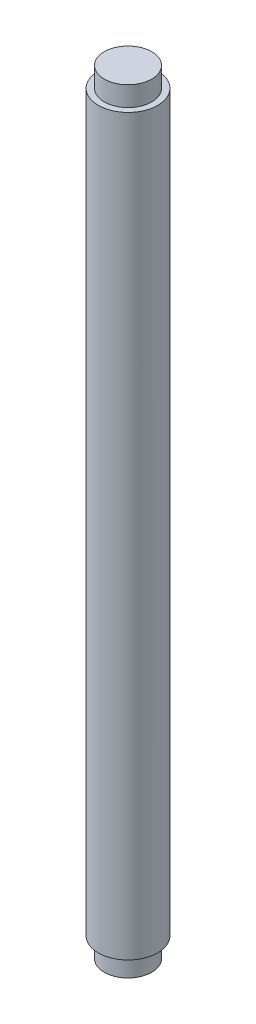
ISO-10303-21;
HEADER;
FILE_DESCRIPTION(('STEP AP214'),'2;1');
FILE_NAME('part.step','',(''),(''),'','','');
FILE_SCHEMA(('AUTOMOTIVE_DESIGN { 1 0 10303 214 1 1 1 1 }'));
ENDSEC;
DATA;
#1=APPLICATION_CONTEXT('core data for automotive mechanical design processes');
#2=APPLICATION_PROTOCOL_DEFINITION('international standard','automotive_design',2000,#1);
#3=PRODUCT_CONTEXT('',#1,'mechanical');
#4=PRODUCT('Part','Part','',(#3));
#5=PRODUCT_RELATED_PRODUCT_CATEGORY('part','',(#4));
#6=PRODUCT_DEFINITION_FORMATION('','',#4);
#7=PRODUCT_DEFINITION_CONTEXT('part definition',#1,'design');
#8=PRODUCT_DEFINITION('design','',#6,#7);
#9=PRODUCT_DEFINITION_SHAPE('','',#8);
#10=(LENGTH_UNIT() NAMED_UNIT(*) SI_UNIT(.MILLI.,.METRE.));
#11=(NAMED_UNIT(*) PLANE_ANGLE_UNIT() SI_UNIT($,.RADIAN.));
#12=(NAMED_UNIT(*) SI_UNIT($,.STERADIAN.) SOLID_ANGLE_UNIT());
#13=UNCERTAINTY_MEASURE_WITH_UNIT(LENGTH_MEASURE(1.E-05),#10,'distance_accuracy_value','');
#14=(GEOMETRIC_REPRESENTATION_CONTEXT(3) GLOBAL_UNCERTAINTY_ASSIGNED_CONTEXT((#13)) GLOBAL_UNIT_ASSIGNED_CONTEXT((#10,
#11,#12)) REPRESENTATION_CONTEXT('',''));
#15=CARTESIAN_POINT('',(0.,0.,0.));
#16=DIRECTION('',(0.,0.,1.));
#17=DIRECTION('',(1.,0.,0.));
#18=AXIS2_PLACEMENT_3D('',#15,#16,#17);
#19=CARTESIAN_POINT('',(0.,195.5,0.));
#20=DIRECTION('',(0.,-1.,0.));
#21=DIRECTION('',(0.,0.,-1.));
#22=AXIS2_PLACEMENT_3D('',#19,#20,#21);
#23=CYLINDRICAL_SURFACE('',#22,15.);
#24=CARTESIAN_POINT('',(0.,185.5,0.));
#25=DIRECTION('',(0.,1.,0.));
#26=DIRECTION('',(0.,0.,1.));
#27=AXIS2_PLACEMENT_3D('',#24,#25,#26);
#28=CIRCLE('',#27,15.);
#29=CARTESIAN_POINT('',(0.,185.5,15.));
#30=VERTEX_POINT('',#29);
#31=EDGE_CURVE('E14',#30,#30,#28,.T.);
#32=ORIENTED_EDGE('',*,*,#31,.F.);
#33=EDGE_LOOP('',(#32));
#34=FACE_BOUND('',#33,.T.);
#35=CARTESIAN_POINT('',(0.,-185.5,0.));
#36=DIRECTION('',(0.,-1.,0.));
#37=DIRECTION('',(0.,0.,-1.));
#38=AXIS2_PLACEMENT_3D('',#35,#36,#37);
#39=CIRCLE('',#38,15.);
#40=CARTESIAN_POINT('',(0.,-185.5,-15.));
#41=VERTEX_POINT('',#40);
#42=EDGE_CURVE('E56',#41,#41,#39,.T.);
#43=ORIENTED_EDGE('',*,*,#42,.F.);
#44=EDGE_LOOP('',(#43));
#45=FACE_BOUND('',#44,.T.);
#46=ADVANCED_FACE('F53',(#34,#45),#23,.T.);
#47=CARTESIAN_POINT('',(0.,185.5,0.));
#48=DIRECTION('',(0.,1.,0.));
#49=DIRECTION('',(0.,0.,1.));
#50=AXIS2_PLACEMENT_3D('',#47,#48,#49);
#51=PLANE('',#50);
#52=CARTESIAN_POINT('',(0.,185.5,0.));
#53=DIRECTION('',(0.,1.,0.));
#54=DIRECTION('',(0.,0.,1.));
#55=AXIS2_PLACEMENT_3D('',#52,#53,#54);
#56=CIRCLE('',#55,12.);
#57=CARTESIAN_POINT('',(0.,185.5,12.));
#58=VERTEX_POINT('',#57);
#59=EDGE_CURVE('E60',#58,#58,#56,.T.);
#60=ORIENTED_EDGE('',*,*,#59,.F.);
#61=EDGE_LOOP('',(#60));
#62=FACE_BOUND('',#61,.T.);
#63=ORIENTED_EDGE('',*,*,#31,.T.);
#64=EDGE_LOOP('',(#63));
#65=FACE_BOUND('',#64,.T.);
#66=ADVANCED_FACE('F96',(#62,#65),#51,.T.);
#67=CARTESIAN_POINT('',(0.,185.5,0.));
#68=DIRECTION('',(0.,1.,0.));
#69=DIRECTION('',(0.,0.,1.));
#70=AXIS2_PLACEMENT_3D('',#67,#68,#69);
#71=CYLINDRICAL_SURFACE('',#70,12.);
#72=ORIENTED_EDGE('',*,*,#59,.T.);
#73=EDGE_LOOP('',(#72));
#74=FACE_BOUND('',#73,.T.);
#75=CARTESIAN_POINT('',(0.,195.5,0.));
#76=DIRECTION('',(0.,1.,0.));
#77=DIRECTION('',(0.,0.,1.));
#78=AXIS2_PLACEMENT_3D('',#75,#76,#77);
#79=CIRCLE('',#78,12.);
#80=CARTESIAN_POINT('',(0.,195.5,12.));
#81=VERTEX_POINT('',#80);
#82=EDGE_CURVE('E86',#81,#81,#79,.T.);
#83=ORIENTED_EDGE('',*,*,#82,.F.);
#84=EDGE_LOOP('',(#83));
#85=FACE_BOUND('',#84,.T.);
#86=ADVANCED_FACE('F101',(#74,#85),#71,.T.);
#87=CARTESIAN_POINT('',(0.,195.5,0.));
#88=DIRECTION('',(0.,1.,0.));
#89=DIRECTION('',(0.,0.,1.));
#90=AXIS2_PLACEMENT_3D('',#87,#88,#89);
#91=PLANE('',#90);
#92=ORIENTED_EDGE('',*,*,#82,.T.);
#93=EDGE_LOOP('',(#92));
#94=FACE_BOUND('',#93,.T.);
#95=ADVANCED_FACE('F109',(#94),#91,.T.);
#96=CARTESIAN_POINT('',(0.,-185.5,0.));
#97=DIRECTION('',(0.,-1.,0.));
#98=DIRECTION('',(0.,0.,-1.));
#99=AXIS2_PLACEMENT_3D('',#96,#97,#98);
#100=PLANE('',#99);
#101=CARTESIAN_POINT('',(0.,-185.5,0.));
#102=DIRECTION('',(0.,1.,0.));
#103=DIRECTION('',(0.,0.,1.));
#104=AXIS2_PLACEMENT_3D('',#101,#102,#103);
#105=CIRCLE('',#104,12.);
#106=CARTESIAN_POINT('',(0.,-185.5,12.));
#107=VERTEX_POINT('',#106);
#108=EDGE_CURVE('E77',#107,#107,#105,.T.);
#109=ORIENTED_EDGE('',*,*,#108,.T.);
#110=EDGE_LOOP('',(#109));
#111=FACE_BOUND('',#110,.T.);
#112=ORIENTED_EDGE('',*,*,#42,.T.);
#113=EDGE_LOOP('',(#112));
#114=FACE_BOUND('',#113,.T.);
#115=ADVANCED_FACE('F93',(#111,#114),#100,.T.);
#116=CARTESIAN_POINT('',(0.,-185.5,0.));
#117=DIRECTION('',(0.,-1.,0.));
#118=DIRECTION('',(0.,0.,-1.));
#119=AXIS2_PLACEMENT_3D('',#116,#117,#118);
#120=CYLINDRICAL_SURFACE('',#119,12.);
#121=ORIENTED_EDGE('',*,*,#108,.F.);
#122=EDGE_LOOP('',(#121));
#123=FACE_BOUND('',#122,.T.);
#124=CARTESIAN_POINT('',(0.,-195.5,0.));
#125=DIRECTION('',(0.,1.,0.));
#126=DIRECTION('',(0.,0.,1.));
#127=AXIS2_PLACEMENT_3D('',#124,#125,#126);
#128=CIRCLE('',#127,12.);
#129=CARTESIAN_POINT('',(0.,-195.5,12.));
#130=VERTEX_POINT('',#129);
#131=EDGE_CURVE('E73',#130,#130,#128,.T.);
#132=ORIENTED_EDGE('',*,*,#131,.T.);
#133=EDGE_LOOP('',(#132));
#134=FACE_BOUND('',#133,.T.);
#135=ADVANCED_FACE('F117',(#123,#134),#120,.T.);
#136=CARTESIAN_POINT('',(0.,-195.5,0.));
#137=DIRECTION('',(0.,1.,0.));
#138=DIRECTION('',(0.,0.,1.));
#139=AXIS2_PLACEMENT_3D('',#136,#137,#138);
#140=PLANE('',#139);
#141=CARTESIAN_POINT('',(0.,-195.5,0.));
#142=DIRECTION('',(0.,-1.,0.));
#143=DIRECTION('',(0.,0.,-1.));
#144=AXIS2_PLACEMENT_3D('',#141,#142,#143);
#145=CIRCLE('',#144,6.75);
#146=CARTESIAN_POINT('',(0.,-195.5,-6.75));
#147=VERTEX_POINT('',#146);
#148=EDGE_CURVE('E74',#147,#147,#145,.T.);
#149=ORIENTED_EDGE('',*,*,#148,.F.);
#150=EDGE_LOOP('',(#149));
#151=FACE_BOUND('',#150,.T.);
#152=ORIENTED_EDGE('',*,*,#131,.F.);
#153=EDGE_LOOP('',(#152));
#154=FACE_BOUND('',#153,.T.);
#155=ADVANCED_FACE('F67',(#151,#154),#140,.F.);
#156=CARTESIAN_POINT('',(0.,-193.5,0.));
#157=DIRECTION('',(0.,-1.,0.));
#158=DIRECTION('',(0.,0.,-1.));
#159=AXIS2_PLACEMENT_3D('',#156,#157,#158);
#160=CONICAL_SURFACE('',#159,6.75,1.02974425867665);
#161=CARTESIAN_POINT('',(0.,-189.444190821564,0.));
#162=VERTEX_POINT('',#161);
#163=VERTEX_LOOP('',#162);
#164=FACE_BOUND('',#163,.T.);
#165=CARTESIAN_POINT('',(0.,-193.5,0.));
#166=DIRECTION('',(0.,-1.,0.));
#167=DIRECTION('',(0.,0.,-1.));
#168=AXIS2_PLACEMENT_3D('',#165,#166,#167);
#169=CIRCLE('',#168,6.75);
#170=CARTESIAN_POINT('',(0.,-193.5,-6.75));
#171=VERTEX_POINT('',#170);
#172=EDGE_CURVE('E71',#171,#171,#169,.T.);
#173=ORIENTED_EDGE('',*,*,#172,.T.);
#174=EDGE_LOOP('',(#173));
#175=FACE_BOUND('',#174,.T.);
#176=ADVANCED_FACE('F63',(#164,#175),#160,.F.);
#177=CARTESIAN_POINT('',(0.,-195.5,0.));
#178=DIRECTION('',(0.,-1.,0.));
#179=DIRECTION('',(0.,0.,-1.));
#180=AXIS2_PLACEMENT_3D('',#177,#178,#179);
#181=CYLINDRICAL_SURFACE('',#180,6.75);
#182=ORIENTED_EDGE('',*,*,#172,.F.);
#183=EDGE_LOOP('',(#182));
#184=FACE_BOUND('',#183,.T.);
#185=ORIENTED_EDGE('',*,*,#148,.T.);
#186=EDGE_LOOP('',(#185));
#187=FACE_BOUND('',#186,.T.);
#188=ADVANCED_FACE('F66',(#184,#187),#181,.F.);
#189=CLOSED_SHELL('',(#46,#66,#86,#95,#115,#135,#155,#176,#188));
#190=MANIFOLD_SOLID_BREP('B2',#189);
#191=ADVANCED_BREP_SHAPE_REPRESENTATION('',(#18,#190),#14);
#192=SHAPE_DEFINITION_REPRESENTATION(#9,#191);
ENDSEC;
END-ISO-10303-21;
